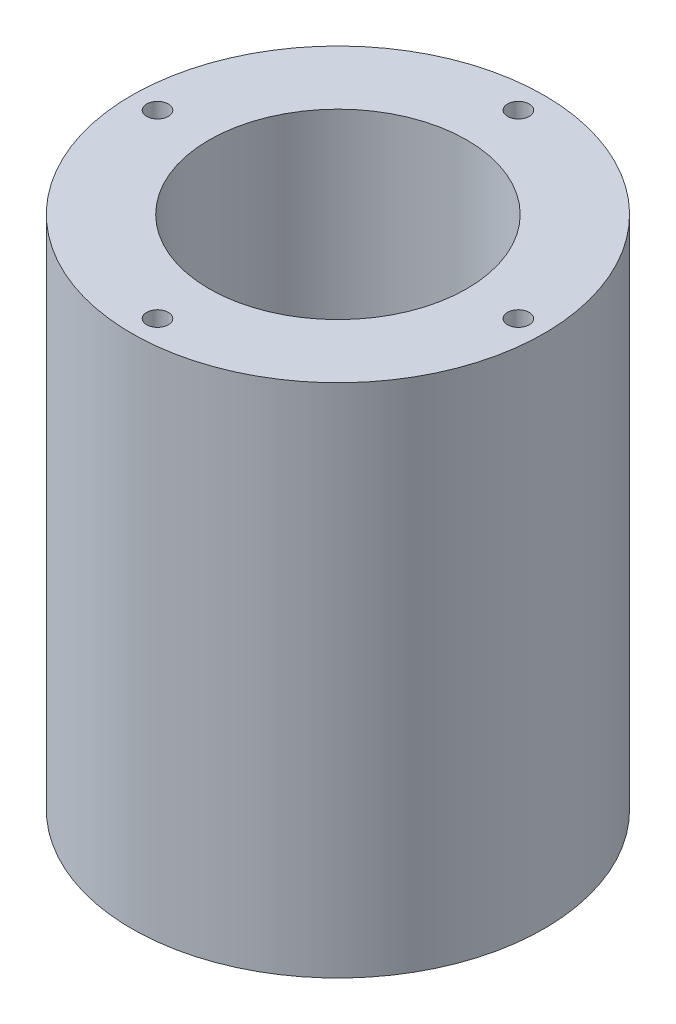
ISO-10303-21;
HEADER;
FILE_DESCRIPTION(('STEP AP214'),'2;1');
FILE_NAME('part.step','',(''),(''),'','','');
FILE_SCHEMA(('AUTOMOTIVE_DESIGN { 1 0 10303 214 1 1 1 1 }'));
ENDSEC;
DATA;
#1=APPLICATION_CONTEXT('core data for automotive mechanical design processes');
#2=APPLICATION_PROTOCOL_DEFINITION('international standard','automotive_design',2000,#1);
#3=PRODUCT_CONTEXT('',#1,'mechanical');
#4=PRODUCT('Part','Part','',(#3));
#5=PRODUCT_RELATED_PRODUCT_CATEGORY('part','',(#4));
#6=PRODUCT_DEFINITION_FORMATION('','',#4);
#7=PRODUCT_DEFINITION_CONTEXT('part definition',#1,'design');
#8=PRODUCT_DEFINITION('design','',#6,#7);
#9=PRODUCT_DEFINITION_SHAPE('','',#8);
#10=(LENGTH_UNIT() NAMED_UNIT(*) SI_UNIT(.MILLI.,.METRE.));
#11=(NAMED_UNIT(*) PLANE_ANGLE_UNIT() SI_UNIT($,.RADIAN.));
#12=(NAMED_UNIT(*) SI_UNIT($,.STERADIAN.) SOLID_ANGLE_UNIT());
#13=UNCERTAINTY_MEASURE_WITH_UNIT(LENGTH_MEASURE(1.E-05),#10,'distance_accuracy_value','');
#14=(GEOMETRIC_REPRESENTATION_CONTEXT(3) GLOBAL_UNCERTAINTY_ASSIGNED_CONTEXT((#13)) GLOBAL_UNIT_ASSIGNED_CONTEXT((#10,
#11,#12)) REPRESENTATION_CONTEXT('',''));
#15=CARTESIAN_POINT('',(0.,0.,0.));
#16=DIRECTION('',(0.,0.,1.));
#17=DIRECTION('',(1.,0.,0.));
#18=AXIS2_PLACEMENT_3D('',#15,#16,#17);
#19=CARTESIAN_POINT('',(0.,-4.99999999999999,0.));
#20=DIRECTION('',(0.,-1.,0.));
#21=DIRECTION('',(0.,0.,-1.));
#22=AXIS2_PLACEMENT_3D('',#19,#20,#21);
#23=PLANE('',#22);
#24=CARTESIAN_POINT('',(0.,-4.99999999999999,0.));
#25=DIRECTION('',(0.,-1.,0.));
#26=DIRECTION('',(0.,0.,-1.));
#27=AXIS2_PLACEMENT_3D('',#24,#25,#26);
#28=CIRCLE('',#27,9.);
#29=CARTESIAN_POINT('',(0.,-4.99999999999999,-9.));
#30=VERTEX_POINT('',#29);
#31=EDGE_CURVE('E362',#30,#30,#28,.T.);
#32=ORIENTED_EDGE('',*,*,#31,.F.);
#33=EDGE_LOOP('',(#32));
#34=FACE_BOUND('',#33,.T.);
#35=CARTESIAN_POINT('',(0.,-4.99999999999999,0.));
#36=DIRECTION('',(0.,-1.,0.));
#37=DIRECTION('',(0.,0.,-1.));
#38=AXIS2_PLACEMENT_3D('',#35,#36,#37);
#39=CIRCLE('',#38,11.1);
#40=CARTESIAN_POINT('',(0.,-4.99999999999999,-11.1));
#41=VERTEX_POINT('',#40);
#42=EDGE_CURVE('E176',#41,#41,#39,.F.);
#43=ORIENTED_EDGE('',*,*,#42,.F.);
#44=EDGE_LOOP('',(#43));
#45=FACE_BOUND('',#44,.T.);
#46=ADVANCED_FACE('F39',(#34,#45),#23,.T.);
#47=CARTESIAN_POINT('',(0.,50.,0.));
#48=DIRECTION('',(0.,-1.,0.));
#49=DIRECTION('',(0.,0.,-1.));
#50=AXIS2_PLACEMENT_3D('',#47,#48,#49);
#51=CYLINDRICAL_SURFACE('',#50,25.);
#52=CARTESIAN_POINT('',(0.,50.,0.));
#53=DIRECTION('',(0.,1.,0.));
#54=DIRECTION('',(0.,0.,1.));
#55=AXIS2_PLACEMENT_3D('',#52,#53,#54);
#56=CIRCLE('',#55,25.);
#57=CARTESIAN_POINT('',(0.,50.,25.));
#58=VERTEX_POINT('',#57);
#59=EDGE_CURVE('E280',#58,#58,#56,.T.);
#60=ORIENTED_EDGE('',*,*,#59,.T.);
#61=EDGE_LOOP('',(#60));
#62=FACE_BOUND('',#61,.T.);
#63=CARTESIAN_POINT('',(0.,-50.,0.));
#64=DIRECTION('',(0.,1.,0.));
#65=DIRECTION('',(0.,0.,1.));
#66=AXIS2_PLACEMENT_3D('',#63,#64,#65);
#67=CIRCLE('',#66,25.);
#68=CARTESIAN_POINT('',(0.,-50.,25.));
#69=VERTEX_POINT('',#68);
#70=EDGE_CURVE('E283',#69,#69,#67,.T.);
#71=ORIENTED_EDGE('',*,*,#70,.F.);
#72=EDGE_LOOP('',(#71));
#73=FACE_BOUND('',#72,.T.);
#74=DIRECTION('',(0.,-1.,0.));
#75=VECTOR('',#74,1.);
#76=CARTESIAN_POINT('',(-6.46564684594965,50.,24.1494391417992));
#77=LINE('',#76,#75);
#78=CARTESIAN_POINT('',(-6.46564684594965,12.,24.1494391417992));
#79=VERTEX_POINT('',#78);
#80=CARTESIAN_POINT('',(-6.46564684594965,-12.,24.1494391417992));
#81=VERTEX_POINT('',#80);
#82=EDGE_CURVE('E175',#79,#81,#77,.T.);
#83=ORIENTED_EDGE('',*,*,#82,.T.);
#84=CARTESIAN_POINT('',(0.,-12.,0.));
#85=DIRECTION('',(0.,-1.,0.));
#86=DIRECTION('',(0.,0.,-1.));
#87=AXIS2_PLACEMENT_3D('',#84,#85,#86);
#88=CIRCLE('',#87,25.);
#89=CARTESIAN_POINT('',(6.46564684594964,-12.,24.1494391417992));
#90=VERTEX_POINT('',#89);
#91=EDGE_CURVE('E172',#81,#90,#88,.F.);
#92=ORIENTED_EDGE('',*,*,#91,.T.);
#93=DIRECTION('',(0.,-1.,0.));
#94=VECTOR('',#93,1.);
#95=CARTESIAN_POINT('',(6.46564684594964,50.,24.1494391417992));
#96=LINE('',#95,#94);
#97=CARTESIAN_POINT('',(6.46564684594964,12.,24.1494391417992));
#98=VERTEX_POINT('',#97);
#99=EDGE_CURVE('E169',#90,#98,#96,.F.);
#100=ORIENTED_EDGE('',*,*,#99,.T.);
#101=CARTESIAN_POINT('',(0.,12.,0.));
#102=DIRECTION('',(0.,-1.,0.));
#103=DIRECTION('',(0.,0.,-1.));
#104=AXIS2_PLACEMENT_3D('',#101,#102,#103);
#105=CIRCLE('',#104,25.);
#106=EDGE_CURVE('E151',#79,#98,#105,.F.);
#107=ORIENTED_EDGE('',*,*,#106,.F.);
#108=EDGE_LOOP('',(#83,#92,#100,#107));
#109=FACE_BOUND('',#108,.T.);
#110=DIRECTION('',(0.,-1.,0.));
#111=VECTOR('',#110,1.);
#112=CARTESIAN_POINT('',(6.46564684594964,50.,-24.1494391417992));
#113=LINE('',#112,#111);
#114=CARTESIAN_POINT('',(6.46564684594964,12.,-24.1494391417992));
#115=VERTEX_POINT('',#114);
#116=CARTESIAN_POINT('',(6.46564684594964,-12.,-24.1494391417992));
#117=VERTEX_POINT('',#116);
#118=EDGE_CURVE('E267',#115,#117,#113,.T.);
#119=ORIENTED_EDGE('',*,*,#118,.T.);
#120=CARTESIAN_POINT('',(0.,-12.,0.));
#121=DIRECTION('',(0.,1.,0.));
#122=DIRECTION('',(0.,0.,1.));
#123=AXIS2_PLACEMENT_3D('',#120,#121,#122);
#124=CIRCLE('',#123,25.);
#125=CARTESIAN_POINT('',(-6.46564684594965,-12.,-24.1494391417992));
#126=VERTEX_POINT('',#125);
#127=EDGE_CURVE('E347',#126,#117,#124,.F.);
#128=ORIENTED_EDGE('',*,*,#127,.F.);
#129=DIRECTION('',(0.,-1.,0.));
#130=VECTOR('',#129,1.);
#131=CARTESIAN_POINT('',(-6.46564684594965,50.,-24.1494391417992));
#132=LINE('',#131,#130);
#133=CARTESIAN_POINT('',(-6.46564684594965,12.,-24.1494391417992));
#134=VERTEX_POINT('',#133);
#135=EDGE_CURVE('E270',#126,#134,#132,.F.);
#136=ORIENTED_EDGE('',*,*,#135,.T.);
#137=CARTESIAN_POINT('',(0.,12.,0.));
#138=DIRECTION('',(0.,1.,0.));
#139=DIRECTION('',(0.,0.,1.));
#140=AXIS2_PLACEMENT_3D('',#137,#138,#139);
#141=CIRCLE('',#140,25.);
#142=EDGE_CURVE('E353',#134,#115,#141,.F.);
#143=ORIENTED_EDGE('',*,*,#142,.T.);
#144=EDGE_LOOP('',(#119,#128,#136,#143));
#145=FACE_BOUND('',#144,.T.);
#146=ADVANCED_FACE('F170',(#62,#73,#109,#145),#51,.F.);
#147=CARTESIAN_POINT('',(0.,50.,0.));
#148=DIRECTION('',(0.,1.,0.));
#149=DIRECTION('',(0.,0.,1.));
#150=AXIS2_PLACEMENT_3D('',#147,#148,#149);
#151=PLANE('',#150);
#152=CARTESIAN_POINT('',(0.,50.,-35.));
#153=DIRECTION('',(0.,1.,0.));
#154=DIRECTION('',(0.,0.,1.));
#155=AXIS2_PLACEMENT_3D('',#152,#153,#154);
#156=CIRCLE('',#155,2.1);
#157=CARTESIAN_POINT('',(0.,50.,-32.9));
#158=VERTEX_POINT('',#157);
#159=EDGE_CURVE('E308',#158,#158,#156,.T.);
#160=ORIENTED_EDGE('',*,*,#159,.F.);
#161=EDGE_LOOP('',(#160));
#162=FACE_BOUND('',#161,.T.);
#163=CARTESIAN_POINT('',(35.000000000001,50.,-9.88330434368617E-13));
#164=DIRECTION('',(0.,1.,0.));
#165=DIRECTION('',(0.,0.,1.));
#166=AXIS2_PLACEMENT_3D('',#163,#164,#165);
#167=CIRCLE('',#166,2.1);
#168=CARTESIAN_POINT('',(35.000000000001,50.,2.09999999999901));
#169=VERTEX_POINT('',#168);
#170=EDGE_CURVE('E305',#169,#169,#167,.T.);
#171=ORIENTED_EDGE('',*,*,#170,.F.);
#172=EDGE_LOOP('',(#171));
#173=FACE_BOUND('',#172,.T.);
#174=CARTESIAN_POINT('',(1.97666086873723E-12,50.,35.));
#175=DIRECTION('',(0.,1.,0.));
#176=DIRECTION('',(0.,0.,1.));
#177=AXIS2_PLACEMENT_3D('',#174,#175,#176);
#178=CIRCLE('',#177,2.1);
#179=CARTESIAN_POINT('',(1.97666086873723E-12,50.,37.1));
#180=VERTEX_POINT('',#179);
#181=EDGE_CURVE('E299',#180,#180,#178,.T.);
#182=ORIENTED_EDGE('',*,*,#181,.F.);
#183=EDGE_LOOP('',(#182));
#184=FACE_BOUND('',#183,.T.);
#185=CARTESIAN_POINT('',(-34.999999999999,50.,9.92616698165632E-13));
#186=DIRECTION('',(0.,1.,0.));
#187=DIRECTION('',(0.,0.,1.));
#188=AXIS2_PLACEMENT_3D('',#185,#186,#187);
#189=CIRCLE('',#188,2.1);
#190=CARTESIAN_POINT('',(-34.999999999999,50.,2.10000000000099));
#191=VERTEX_POINT('',#190);
#192=EDGE_CURVE('E292',#191,#191,#189,.T.);
#193=ORIENTED_EDGE('',*,*,#192,.F.);
#194=EDGE_LOOP('',(#193));
#195=FACE_BOUND('',#194,.T.);
#196=CARTESIAN_POINT('',(0.,50.,0.));
#197=DIRECTION('',(0.,1.,0.));
#198=DIRECTION('',(0.,0.,1.));
#199=AXIS2_PLACEMENT_3D('',#196,#197,#198);
#200=CIRCLE('',#199,40.);
#201=CARTESIAN_POINT('',(0.,50.,-40.));
#202=VERTEX_POINT('',#201);
#203=EDGE_CURVE('E276',#202,#202,#200,.T.);
#204=ORIENTED_EDGE('',*,*,#203,.T.);
#205=EDGE_LOOP('',(#204));
#206=FACE_BOUND('',#205,.T.);
#207=ORIENTED_EDGE('',*,*,#59,.F.);
#208=EDGE_LOOP('',(#207));
#209=FACE_BOUND('',#208,.T.);
#210=ADVANCED_FACE('F416',(#162,#173,#184,#195,#206,#209),#151,.T.);
#211=CARTESIAN_POINT('',(0.,-50.,0.));
#212=DIRECTION('',(0.,1.,0.));
#213=DIRECTION('',(0.,0.,1.));
#214=AXIS2_PLACEMENT_3D('',#211,#212,#213);
#215=PLANE('',#214);
#216=CARTESIAN_POINT('',(0.,-50.,-35.));
#217=DIRECTION('',(0.,1.,0.));
#218=DIRECTION('',(0.,0.,1.));
#219=AXIS2_PLACEMENT_3D('',#216,#217,#218);
#220=CIRCLE('',#219,2.1);
#221=CARTESIAN_POINT('',(0.,-50.,-32.9));
#222=VERTEX_POINT('',#221);
#223=EDGE_CURVE('E331',#222,#222,#220,.T.);
#224=ORIENTED_EDGE('',*,*,#223,.T.);
#225=EDGE_LOOP('',(#224));
#226=FACE_BOUND('',#225,.T.);
#227=CARTESIAN_POINT('',(35.000000000001,-50.,-9.88330434368617E-13));
#228=DIRECTION('',(0.,1.,0.));
#229=DIRECTION('',(0.,0.,1.));
#230=AXIS2_PLACEMENT_3D('',#227,#228,#229);
#231=CIRCLE('',#230,2.1);
#232=CARTESIAN_POINT('',(35.000000000001,-50.,2.09999999999901));
#233=VERTEX_POINT('',#232);
#234=EDGE_CURVE('E325',#233,#233,#231,.T.);
#235=ORIENTED_EDGE('',*,*,#234,.T.);
#236=EDGE_LOOP('',(#235));
#237=FACE_BOUND('',#236,.T.);
#238=CARTESIAN_POINT('',(1.97666086873723E-12,-50.,35.));
#239=DIRECTION('',(0.,1.,0.));
#240=DIRECTION('',(0.,0.,1.));
#241=AXIS2_PLACEMENT_3D('',#238,#239,#240);
#242=CIRCLE('',#241,2.1);
#243=CARTESIAN_POINT('',(1.97666086873723E-12,-50.,37.1));
#244=VERTEX_POINT('',#243);
#245=EDGE_CURVE('E319',#244,#244,#242,.T.);
#246=ORIENTED_EDGE('',*,*,#245,.T.);
#247=EDGE_LOOP('',(#246));
#248=FACE_BOUND('',#247,.T.);
#249=CARTESIAN_POINT('',(-34.999999999999,-50.,9.92616698165632E-13));
#250=DIRECTION('',(0.,1.,0.));
#251=DIRECTION('',(0.,0.,1.));
#252=AXIS2_PLACEMENT_3D('',#249,#250,#251);
#253=CIRCLE('',#252,2.1);
#254=CARTESIAN_POINT('',(-34.999999999999,-50.,2.10000000000099));
#255=VERTEX_POINT('',#254);
#256=EDGE_CURVE('E313',#255,#255,#253,.T.);
#257=ORIENTED_EDGE('',*,*,#256,.T.);
#258=EDGE_LOOP('',(#257));
#259=FACE_BOUND('',#258,.T.);
#260=CARTESIAN_POINT('',(0.,-50.,0.));
#261=DIRECTION('',(0.,1.,0.));
#262=DIRECTION('',(0.,0.,1.));
#263=AXIS2_PLACEMENT_3D('',#260,#261,#262);
#264=CIRCLE('',#263,40.);
#265=CARTESIAN_POINT('',(0.,-50.,-40.));
#266=VERTEX_POINT('',#265);
#267=EDGE_CURVE('E277',#266,#266,#264,.T.);
#268=ORIENTED_EDGE('',*,*,#267,.F.);
#269=EDGE_LOOP('',(#268));
#270=FACE_BOUND('',#269,.T.);
#271=ORIENTED_EDGE('',*,*,#70,.T.);
#272=EDGE_LOOP('',(#271));
#273=FACE_BOUND('',#272,.T.);
#274=ADVANCED_FACE('F516',(#226,#237,#248,#259,#270,#273),#215,.F.);
#275=CARTESIAN_POINT('',(0.,50.,0.));
#276=DIRECTION('',(0.,-1.,0.));
#277=DIRECTION('',(0.,0.,-1.));
#278=AXIS2_PLACEMENT_3D('',#275,#276,#277);
#279=CYLINDRICAL_SURFACE('',#278,40.);
#280=CARTESIAN_POINT('',(0.,50.,-40.));
#281=CARTESIAN_POINT('',(0.,48.9583333333333,-40.));
#282=CARTESIAN_POINT('',(0.,47.9166666666667,-40.));
#283=CARTESIAN_POINT('',(0.,45.8333333333333,-40.));
#284=CARTESIAN_POINT('',(0.,44.7916666666667,-40.));
#285=CARTESIAN_POINT('',(0.,42.7083333333333,-40.));
#286=CARTESIAN_POINT('',(0.,41.6666666666667,-40.));
#287=CARTESIAN_POINT('',(0.,39.5833333333333,-40.));
#288=CARTESIAN_POINT('',(0.,38.5416666666667,-40.));
#289=CARTESIAN_POINT('',(0.,36.4583333333333,-40.));
#290=CARTESIAN_POINT('',(0.,35.4166666666667,-40.));
#291=CARTESIAN_POINT('',(0.,33.3333333333333,-40.));
#292=CARTESIAN_POINT('',(0.,32.2916666666667,-40.));
#293=CARTESIAN_POINT('',(0.,30.2083333333333,-40.));
#294=CARTESIAN_POINT('',(0.,29.1666666666667,-40.));
#295=CARTESIAN_POINT('',(0.,27.0833333333333,-40.));
#296=CARTESIAN_POINT('',(0.,26.0416666666667,-40.));
#297=CARTESIAN_POINT('',(0.,23.9583333333333,-40.));
#298=CARTESIAN_POINT('',(0.,22.9166666666667,-40.));
#299=CARTESIAN_POINT('',(0.,20.8333333333333,-40.));
#300=CARTESIAN_POINT('',(0.,19.7916666666667,-40.));
#301=CARTESIAN_POINT('',(0.,17.7083333333333,-40.));
#302=CARTESIAN_POINT('',(0.,16.6666666666667,-40.));
#303=CARTESIAN_POINT('',(0.,14.5833333333333,-40.));
#304=CARTESIAN_POINT('',(0.,13.5416666666667,-40.));
#305=CARTESIAN_POINT('',(0.,11.4583333333333,-40.));
#306=CARTESIAN_POINT('',(0.,10.4166666666667,-40.));
#307=CARTESIAN_POINT('',(0.,8.33333333333333,-40.));
#308=CARTESIAN_POINT('',(0.,7.29166666666666,-40.));
#309=CARTESIAN_POINT('',(0.,5.20833333333333,-40.));
#310=CARTESIAN_POINT('',(0.,4.16666666666666,-40.));
#311=CARTESIAN_POINT('',(0.,2.08333333333333,-40.));
#312=CARTESIAN_POINT('',(0.,1.04166666666666,-40.));
#313=CARTESIAN_POINT('',(0.,-1.04166666666667,-40.));
#314=CARTESIAN_POINT('',(0.,-2.08333333333334,-40.));
#315=CARTESIAN_POINT('',(0.,-4.16666666666667,-40.));
#316=CARTESIAN_POINT('',(0.,-5.20833333333334,-40.));
#317=CARTESIAN_POINT('',(0.,-7.29166666666667,-40.));
#318=CARTESIAN_POINT('',(0.,-8.33333333333334,-40.));
#319=CARTESIAN_POINT('',(0.,-10.4166666666667,-40.));
#320=CARTESIAN_POINT('',(0.,-11.4583333333333,-40.));
#321=CARTESIAN_POINT('',(0.,-13.5416666666667,-40.));
#322=CARTESIAN_POINT('',(0.,-14.5833333333333,-40.));
#323=CARTESIAN_POINT('',(0.,-16.6666666666667,-40.));
#324=CARTESIAN_POINT('',(0.,-17.7083333333333,-40.));
#325=CARTESIAN_POINT('',(0.,-19.7916666666667,-40.));
#326=CARTESIAN_POINT('',(0.,-20.8333333333333,-40.));
#327=CARTESIAN_POINT('',(0.,-22.9166666666667,-40.));
#328=CARTESIAN_POINT('',(0.,-23.9583333333333,-40.));
#329=CARTESIAN_POINT('',(0.,-26.0416666666667,-40.));
#330=CARTESIAN_POINT('',(0.,-27.0833333333333,-40.));
#331=CARTESIAN_POINT('',(0.,-29.1666666666667,-40.));
#332=CARTESIAN_POINT('',(0.,-30.2083333333333,-40.));
#333=CARTESIAN_POINT('',(0.,-32.2916666666667,-40.));
#334=CARTESIAN_POINT('',(0.,-33.3333333333333,-40.));
#335=CARTESIAN_POINT('',(0.,-35.4166666666667,-40.));
#336=CARTESIAN_POINT('',(0.,-36.4583333333333,-40.));
#337=CARTESIAN_POINT('',(0.,-38.5416666666667,-40.));
#338=CARTESIAN_POINT('',(0.,-39.5833333333333,-40.));
#339=CARTESIAN_POINT('',(0.,-41.6666666666667,-40.));
#340=CARTESIAN_POINT('',(0.,-42.7083333333333,-40.));
#341=CARTESIAN_POINT('',(0.,-44.7916666666667,-40.));
#342=CARTESIAN_POINT('',(0.,-45.8333333333333,-40.));
#343=CARTESIAN_POINT('',(0.,-47.9166666666667,-40.));
#344=CARTESIAN_POINT('',(0.,-48.9583333333333,-40.));
#345=CARTESIAN_POINT('',(0.,-50.,-40.));
#346=B_SPLINE_CURVE_WITH_KNOTS('',3,(#280,#281,#282,#283,#284,#285,#286,#287,#288,#289,#290,
#291,#292,#293,#294,#295,#296,#297,#298,#299,#300,#301,#302,#303,#304,#305,#306,#307,#308,#309,
#310,#311,#312,#313,#314,#315,#316,#317,#318,#319,#320,#321,#322,#323,#324,#325,#326,#327,#328,
#329,#330,#331,#332,#333,#334,#335,#336,#337,#338,#339,#340,#341,#342,#343,#344,#345),
.UNSPECIFIED.,.F.,.F.,(4,2,2,2,2,2,2,2,2,2,2,2,2,2,2,2,2,2,2,2,2,2,2,2,2,2,2,2,2,2,2,2,4),(0.,
3.125,6.25,9.37499999999999,12.5,15.625,18.75,21.875,25.,28.125,31.25,34.375,37.5,40.625,43.75,
46.875,50.,53.125,56.25,59.375,62.5,65.625,68.75,71.875,75.,78.125,81.25,84.375,87.5,90.625,
93.75,96.875,100.),.UNSPECIFIED.);
#347=EDGE_CURVE('BSEAM509',#202,#266,#346,.T.);
#348=ORIENTED_EDGE('',*,*,#203,.F.);
#349=ORIENTED_EDGE('',*,*,#267,.T.);
#350=ORIENTED_EDGE('',*,*,#347,.T.);
#351=ORIENTED_EDGE('',*,*,#347,.F.);
#352=EDGE_LOOP('',(#348,#350,#349,#351));
#353=FACE_BOUND('',#352,.T.);
#354=ADVANCED_FACE('F509',(#353),#279,.T.);
#355=CARTESIAN_POINT('',(-34.999999999999,40.,9.92616698165632E-13));
#356=DIRECTION('',(0.,1.,0.));
#357=DIRECTION('',(0.,0.,1.));
#358=AXIS2_PLACEMENT_3D('',#355,#356,#357);
#359=CYLINDRICAL_SURFACE('',#358,2.1);
#360=CARTESIAN_POINT('',(-34.999999999999,40.,9.92616698165632E-13));
#361=DIRECTION('',(0.,1.,0.));
#362=DIRECTION('',(0.,0.,1.));
#363=AXIS2_PLACEMENT_3D('',#360,#361,#362);
#364=CIRCLE('',#363,2.1);
#365=CARTESIAN_POINT('',(-34.999999999999,40.,2.10000000000099));
#366=VERTEX_POINT('',#365);
#367=EDGE_CURVE('E289',#366,#366,#364,.T.);
#368=ORIENTED_EDGE('',*,*,#367,.F.);
#369=EDGE_LOOP('',(#368));
#370=FACE_BOUND('',#369,.T.);
#371=ORIENTED_EDGE('',*,*,#192,.T.);
#372=EDGE_LOOP('',(#371));
#373=FACE_BOUND('',#372,.T.);
#374=ADVANCED_FACE('F506',(#370,#373),#359,.F.);
#375=CARTESIAN_POINT('',(-34.999999999999,40.,9.92616698165632E-13));
#376=DIRECTION('',(0.,1.,0.));
#377=DIRECTION('',(0.,0.,1.));
#378=AXIS2_PLACEMENT_3D('',#375,#376,#377);
#379=PLANE('',#378);
#380=ORIENTED_EDGE('',*,*,#367,.T.);
#381=EDGE_LOOP('',(#380));
#382=FACE_BOUND('',#381,.T.);
#383=ADVANCED_FACE('F501',(#382),#379,.T.);
#384=CARTESIAN_POINT('',(1.97666086873723E-12,40.,35.));
#385=DIRECTION('',(0.,1.,0.));
#386=DIRECTION('',(0.,0.,1.));
#387=AXIS2_PLACEMENT_3D('',#384,#385,#386);
#388=CYLINDRICAL_SURFACE('',#387,2.1);
#389=CARTESIAN_POINT('',(1.97666086873723E-12,40.,35.));
#390=DIRECTION('',(0.,1.,0.));
#391=DIRECTION('',(0.,0.,1.));
#392=AXIS2_PLACEMENT_3D('',#389,#390,#391);
#393=CIRCLE('',#392,2.1);
#394=CARTESIAN_POINT('',(1.97666086873723E-12,40.,37.1));
#395=VERTEX_POINT('',#394);
#396=EDGE_CURVE('E296',#395,#395,#393,.T.);
#397=ORIENTED_EDGE('',*,*,#396,.F.);
#398=EDGE_LOOP('',(#397));
#399=FACE_BOUND('',#398,.T.);
#400=ORIENTED_EDGE('',*,*,#181,.T.);
#401=EDGE_LOOP('',(#400));
#402=FACE_BOUND('',#401,.T.);
#403=ADVANCED_FACE('F498',(#399,#402),#388,.F.);
#404=CARTESIAN_POINT('',(1.97666086873723E-12,40.,35.));
#405=DIRECTION('',(0.,1.,0.));
#406=DIRECTION('',(0.,0.,1.));
#407=AXIS2_PLACEMENT_3D('',#404,#405,#406);
#408=PLANE('',#407);
#409=ORIENTED_EDGE('',*,*,#396,.T.);
#410=EDGE_LOOP('',(#409));
#411=FACE_BOUND('',#410,.T.);
#412=ADVANCED_FACE('F493',(#411),#408,.T.);
#413=CARTESIAN_POINT('',(35.000000000001,40.,-9.88330434368617E-13));
#414=DIRECTION('',(0.,1.,0.));
#415=DIRECTION('',(0.,0.,1.));
#416=AXIS2_PLACEMENT_3D('',#413,#414,#415);
#417=CYLINDRICAL_SURFACE('',#416,2.1);
#418=CARTESIAN_POINT('',(35.000000000001,40.,-9.88330434368617E-13));
#419=DIRECTION('',(0.,1.,0.));
#420=DIRECTION('',(0.,0.,1.));
#421=AXIS2_PLACEMENT_3D('',#418,#419,#420);
#422=CIRCLE('',#421,2.1);
#423=CARTESIAN_POINT('',(35.000000000001,40.,2.09999999999901));
#424=VERTEX_POINT('',#423);
#425=EDGE_CURVE('E302',#424,#424,#422,.T.);
#426=ORIENTED_EDGE('',*,*,#425,.F.);
#427=EDGE_LOOP('',(#426));
#428=FACE_BOUND('',#427,.T.);
#429=ORIENTED_EDGE('',*,*,#170,.T.);
#430=EDGE_LOOP('',(#429));
#431=FACE_BOUND('',#430,.T.);
#432=ADVANCED_FACE('F490',(#428,#431),#417,.F.);
#433=CARTESIAN_POINT('',(35.000000000001,40.,-9.88330434368617E-13));
#434=DIRECTION('',(0.,1.,0.));
#435=DIRECTION('',(0.,0.,1.));
#436=AXIS2_PLACEMENT_3D('',#433,#434,#435);
#437=PLANE('',#436);
#438=ORIENTED_EDGE('',*,*,#425,.T.);
#439=EDGE_LOOP('',(#438));
#440=FACE_BOUND('',#439,.T.);
#441=ADVANCED_FACE('F488',(#440),#437,.T.);
#442=CARTESIAN_POINT('',(0.,40.,-35.));
#443=DIRECTION('',(0.,1.,0.));
#444=DIRECTION('',(0.,0.,1.));
#445=AXIS2_PLACEMENT_3D('',#442,#443,#444);
#446=CYLINDRICAL_SURFACE('',#445,2.1);
#447=CARTESIAN_POINT('',(0.,40.,-35.));
#448=DIRECTION('',(0.,1.,0.));
#449=DIRECTION('',(0.,0.,1.));
#450=AXIS2_PLACEMENT_3D('',#447,#448,#449);
#451=CIRCLE('',#450,2.1);
#452=CARTESIAN_POINT('',(0.,40.,-32.9));
#453=VERTEX_POINT('',#452);
#454=EDGE_CURVE('E286',#453,#453,#451,.T.);
#455=ORIENTED_EDGE('',*,*,#454,.F.);
#456=EDGE_LOOP('',(#455));
#457=FACE_BOUND('',#456,.T.);
#458=ORIENTED_EDGE('',*,*,#159,.T.);
#459=EDGE_LOOP('',(#458));
#460=FACE_BOUND('',#459,.T.);
#461=ADVANCED_FACE('F484',(#457,#460),#446,.F.);
#462=CARTESIAN_POINT('',(0.,40.,-35.));
#463=DIRECTION('',(0.,1.,0.));
#464=DIRECTION('',(0.,0.,1.));
#465=AXIS2_PLACEMENT_3D('',#462,#463,#464);
#466=PLANE('',#465);
#467=ORIENTED_EDGE('',*,*,#454,.T.);
#468=EDGE_LOOP('',(#467));
#469=FACE_BOUND('',#468,.T.);
#470=ADVANCED_FACE('F480',(#469),#466,.T.);
#471=CARTESIAN_POINT('',(-34.999999999999,-40.,9.92616698165632E-13));
#472=DIRECTION('',(0.,-1.,0.));
#473=DIRECTION('',(0.,0.,-1.));
#474=AXIS2_PLACEMENT_3D('',#471,#472,#473);
#475=CYLINDRICAL_SURFACE('',#474,2.1);
#476=CARTESIAN_POINT('',(-34.999999999999,-40.,9.92616698165632E-13));
#477=DIRECTION('',(0.,1.,0.));
#478=DIRECTION('',(0.,0.,1.));
#479=AXIS2_PLACEMENT_3D('',#476,#477,#478);
#480=CIRCLE('',#479,2.1);
#481=CARTESIAN_POINT('',(-34.999999999999,-40.,2.10000000000099));
#482=VERTEX_POINT('',#481);
#483=EDGE_CURVE('E316',#482,#482,#480,.T.);
#484=ORIENTED_EDGE('',*,*,#483,.T.);
#485=EDGE_LOOP('',(#484));
#486=FACE_BOUND('',#485,.T.);
#487=ORIENTED_EDGE('',*,*,#256,.F.);
#488=EDGE_LOOP('',(#487));
#489=FACE_BOUND('',#488,.T.);
#490=ADVANCED_FACE('F476',(#486,#489),#475,.F.);
#491=CARTESIAN_POINT('',(-34.999999999999,-40.,9.92616698165632E-13));
#492=DIRECTION('',(0.,-1.,0.));
#493=DIRECTION('',(0.,0.,1.));
#494=AXIS2_PLACEMENT_3D('',#491,#492,#493);
#495=PLANE('',#494);
#496=ORIENTED_EDGE('',*,*,#483,.F.);
#497=EDGE_LOOP('',(#496));
#498=FACE_BOUND('',#497,.T.);
#499=ADVANCED_FACE('F472',(#498),#495,.T.);
#500=CARTESIAN_POINT('',(1.97666086873723E-12,-40.,35.));
#501=DIRECTION('',(0.,-1.,0.));
#502=DIRECTION('',(0.,0.,-1.));
#503=AXIS2_PLACEMENT_3D('',#500,#501,#502);
#504=CYLINDRICAL_SURFACE('',#503,2.1);
#505=CARTESIAN_POINT('',(1.97666086873723E-12,-40.,35.));
#506=DIRECTION('',(0.,1.,0.));
#507=DIRECTION('',(0.,0.,1.));
#508=AXIS2_PLACEMENT_3D('',#505,#506,#507);
#509=CIRCLE('',#508,2.1);
#510=CARTESIAN_POINT('',(1.97666086873723E-12,-40.,37.1));
#511=VERTEX_POINT('',#510);
#512=EDGE_CURVE('E322',#511,#511,#509,.T.);
#513=ORIENTED_EDGE('',*,*,#512,.T.);
#514=EDGE_LOOP('',(#513));
#515=FACE_BOUND('',#514,.T.);
#516=ORIENTED_EDGE('',*,*,#245,.F.);
#517=EDGE_LOOP('',(#516));
#518=FACE_BOUND('',#517,.T.);
#519=ADVANCED_FACE('F468',(#515,#518),#504,.F.);
#520=CARTESIAN_POINT('',(1.97666086873723E-12,-40.,35.));
#521=DIRECTION('',(0.,-1.,0.));
#522=DIRECTION('',(0.,0.,1.));
#523=AXIS2_PLACEMENT_3D('',#520,#521,#522);
#524=PLANE('',#523);
#525=ORIENTED_EDGE('',*,*,#512,.F.);
#526=EDGE_LOOP('',(#525));
#527=FACE_BOUND('',#526,.T.);
#528=ADVANCED_FACE('F464',(#527),#524,.T.);
#529=CARTESIAN_POINT('',(35.000000000001,-40.,-9.88330434368617E-13));
#530=DIRECTION('',(0.,-1.,0.));
#531=DIRECTION('',(0.,0.,-1.));
#532=AXIS2_PLACEMENT_3D('',#529,#530,#531);
#533=CYLINDRICAL_SURFACE('',#532,2.1);
#534=CARTESIAN_POINT('',(35.000000000001,-40.,-9.88330434368617E-13));
#535=DIRECTION('',(0.,1.,0.));
#536=DIRECTION('',(0.,0.,1.));
#537=AXIS2_PLACEMENT_3D('',#534,#535,#536);
#538=CIRCLE('',#537,2.1);
#539=CARTESIAN_POINT('',(35.000000000001,-40.,2.09999999999901));
#540=VERTEX_POINT('',#539);
#541=EDGE_CURVE('E328',#540,#540,#538,.T.);
#542=ORIENTED_EDGE('',*,*,#541,.T.);
#543=EDGE_LOOP('',(#542));
#544=FACE_BOUND('',#543,.T.);
#545=ORIENTED_EDGE('',*,*,#234,.F.);
#546=EDGE_LOOP('',(#545));
#547=FACE_BOUND('',#546,.T.);
#548=ADVANCED_FACE('F460',(#544,#547),#533,.F.);
#549=CARTESIAN_POINT('',(35.000000000001,-40.,-9.88330434368617E-13));
#550=DIRECTION('',(0.,-1.,0.));
#551=DIRECTION('',(0.,0.,1.));
#552=AXIS2_PLACEMENT_3D('',#549,#550,#551);
#553=PLANE('',#552);
#554=ORIENTED_EDGE('',*,*,#541,.F.);
#555=EDGE_LOOP('',(#554));
#556=FACE_BOUND('',#555,.T.);
#557=ADVANCED_FACE('F456',(#556),#553,.T.);
#558=CARTESIAN_POINT('',(0.,-40.,-35.));
#559=DIRECTION('',(0.,-1.,0.));
#560=DIRECTION('',(0.,0.,-1.));
#561=AXIS2_PLACEMENT_3D('',#558,#559,#560);
#562=CYLINDRICAL_SURFACE('',#561,2.1);
#563=CARTESIAN_POINT('',(0.,-40.,-35.));
#564=DIRECTION('',(0.,1.,0.));
#565=DIRECTION('',(0.,0.,1.));
#566=AXIS2_PLACEMENT_3D('',#563,#564,#565);
#567=CIRCLE('',#566,2.1);
#568=CARTESIAN_POINT('',(0.,-40.,-32.9));
#569=VERTEX_POINT('',#568);
#570=EDGE_CURVE('E293',#569,#569,#567,.T.);
#571=ORIENTED_EDGE('',*,*,#570,.T.);
#572=EDGE_LOOP('',(#571));
#573=FACE_BOUND('',#572,.T.);
#574=ORIENTED_EDGE('',*,*,#223,.F.);
#575=EDGE_LOOP('',(#574));
#576=FACE_BOUND('',#575,.T.);
#577=ADVANCED_FACE('F452',(#573,#576),#562,.F.);
#578=CARTESIAN_POINT('',(0.,-40.,-35.));
#579=DIRECTION('',(0.,-1.,0.));
#580=DIRECTION('',(0.,0.,1.));
#581=AXIS2_PLACEMENT_3D('',#578,#579,#580);
#582=PLANE('',#581);
#583=ORIENTED_EDGE('',*,*,#570,.F.);
#584=EDGE_LOOP('',(#583));
#585=FACE_BOUND('',#584,.T.);
#586=ADVANCED_FACE('F446',(#585),#582,.T.);
#587=CARTESIAN_POINT('',(0.,12.,0.));
#588=DIRECTION('',(0.984807753012208,0.,0.173648177666931));
#589=DIRECTION('',(0.173648177666931,0.,-0.984807753012208));
#590=AXIS2_PLACEMENT_3D('',#587,#588,#589);
#591=PLANE('',#590);
#592=DIRECTION('',(-0.173648177666931,0.,0.984807753012208));
#593=VECTOR('',#592,1.);
#594=CARTESIAN_POINT('',(0.,-12.,0.));
#595=LINE('',#594,#593);
#596=CARTESIAN_POINT('',(-2.93151864022867,-12.,16.6254683681992));
#597=VERTEX_POINT('',#596);
#598=CARTESIAN_POINT('',(-3.97877959224926,-12.,22.5647803657891));
#599=VERTEX_POINT('',#598);
#600=EDGE_CURVE('E242',#597,#599,#595,.T.);
#601=ORIENTED_EDGE('',*,*,#600,.T.);
#602=DIRECTION('',(0.,-1.,0.));
#603=VECTOR('',#602,1.);
#604=CARTESIAN_POINT('',(-3.97877959224926,12.,22.5647803657891));
#605=LINE('',#604,#603);
#606=CARTESIAN_POINT('',(-3.97877959224926,12.,22.5647803657891));
#607=VERTEX_POINT('',#606);
#608=EDGE_CURVE('E249',#599,#607,#605,.F.);
#609=ORIENTED_EDGE('',*,*,#608,.T.);
#610=DIRECTION('',(-0.173648177666931,0.,0.984807753012208));
#611=VECTOR('',#610,1.);
#612=CARTESIAN_POINT('',(0.,12.,0.));
#613=LINE('',#612,#611);
#614=CARTESIAN_POINT('',(-2.93151864022867,12.,16.6254683681992));
#615=VERTEX_POINT('',#614);
#616=EDGE_CURVE('E165',#615,#607,#613,.T.);
#617=ORIENTED_EDGE('',*,*,#616,.F.);
#618=DIRECTION('',(0.,1.,0.));
#619=VECTOR('',#618,1.);
#620=CARTESIAN_POINT('',(-2.93151864022867,12.,16.6254683681992));
#621=LINE('',#620,#619);
#622=EDGE_CURVE('E251',#615,#597,#621,.F.);
#623=ORIENTED_EDGE('',*,*,#622,.T.);
#624=EDGE_LOOP('',(#601,#609,#617,#623));
#625=FACE_BOUND('',#624,.T.);
#626=ADVANCED_FACE('F247',(#625),#591,.F.);
#627=CARTESIAN_POINT('',(0.,12.,0.));
#628=DIRECTION('',(0.984807753012208,0.,-0.173648177666931));
#629=DIRECTION('',(-0.173648177666931,0.,-0.984807753012208));
#630=AXIS2_PLACEMENT_3D('',#627,#628,#629);
#631=PLANE('',#630);
#632=DIRECTION('',(0.173648177666931,0.,0.984807753012208));
#633=VECTOR('',#632,1.);
#634=CARTESIAN_POINT('',(0.,12.,0.));
#635=LINE('',#634,#633);
#636=CARTESIAN_POINT('',(2.93151864022866,12.,16.6254683681992));
#637=VERTEX_POINT('',#636);
#638=CARTESIAN_POINT('',(3.97877959224925,12.,22.5647803657891));
#639=VERTEX_POINT('',#638);
#640=EDGE_CURVE('E166',#637,#639,#635,.T.);
#641=ORIENTED_EDGE('',*,*,#640,.T.);
#642=DIRECTION('',(0.,1.,0.));
#643=VECTOR('',#642,1.);
#644=CARTESIAN_POINT('',(3.97877959224925,-12.,22.5647803657891));
#645=LINE('',#644,#643);
#646=CARTESIAN_POINT('',(3.97877959224925,-12.,22.5647803657891));
#647=VERTEX_POINT('',#646);
#648=EDGE_CURVE('E181',#639,#647,#645,.F.);
#649=ORIENTED_EDGE('',*,*,#648,.T.);
#650=DIRECTION('',(0.173648177666931,0.,0.984807753012208));
#651=VECTOR('',#650,1.);
#652=CARTESIAN_POINT('',(0.,-12.,0.));
#653=LINE('',#652,#651);
#654=CARTESIAN_POINT('',(2.93151864022866,-12.,16.6254683681992));
#655=VERTEX_POINT('',#654);
#656=EDGE_CURVE('E337',#655,#647,#653,.T.);
#657=ORIENTED_EDGE('',*,*,#656,.F.);
#658=DIRECTION('',(0.,-1.,0.));
#659=VECTOR('',#658,1.);
#660=CARTESIAN_POINT('',(2.93151864022866,12.,16.6254683681992));
#661=LINE('',#660,#659);
#662=EDGE_CURVE('E220',#655,#637,#661,.F.);
#663=ORIENTED_EDGE('',*,*,#662,.T.);
#664=EDGE_LOOP('',(#641,#649,#657,#663));
#665=FACE_BOUND('',#664,.T.);
#666=ADVANCED_FACE('F441',(#665),#631,.T.);
#667=CARTESIAN_POINT('',(0.,12.,0.));
#668=DIRECTION('',(0.,-1.,0.));
#669=DIRECTION('',(0.,0.,-1.));
#670=AXIS2_PLACEMENT_3D('',#667,#668,#669);
#671=PLANE('',#670);
#672=ORIENTED_EDGE('',*,*,#640,.F.);
#673=CARTESIAN_POINT('',(4.90113414625308,12.,16.2781720128653));
#674=DIRECTION('',(0.,-1.,0.));
#675=DIRECTION('',(0.,0.,-1.));
#676=AXIS2_PLACEMENT_3D('',#673,#674,#675);
#677=CIRCLE('',#676,2.);
#678=CARTESIAN_POINT('',(4.32453012904683,12.,14.3630929525282));
#679=VERTEX_POINT('',#678);
#680=EDGE_CURVE('E196',#637,#679,#677,.T.);
#681=ORIENTED_EDGE('',*,*,#680,.T.);
#682=CARTESIAN_POINT('',(0.,12.,0.));
#683=DIRECTION('',(0.,1.,0.));
#684=DIRECTION('',(0.,0.,1.));
#685=AXIS2_PLACEMENT_3D('',#682,#683,#684);
#686=CIRCLE('',#685,15.);
#687=CARTESIAN_POINT('',(4.32453012904683,12.,-14.3630929525282));
#688=VERTEX_POINT('',#687);
#689=EDGE_CURVE('E200',#679,#688,#686,.T.);
#690=ORIENTED_EDGE('',*,*,#689,.T.);
#691=CARTESIAN_POINT('',(4.90113414625308,12.,-16.2781720128653));
#692=DIRECTION('',(0.,-1.,0.));
#693=DIRECTION('',(0.,0.,-1.));
#694=AXIS2_PLACEMENT_3D('',#691,#692,#693);
#695=CIRCLE('',#694,2.);
#696=CARTESIAN_POINT('',(2.93151864022866,12.,-16.6254683681992));
#697=VERTEX_POINT('',#696);
#698=EDGE_CURVE('E185',#688,#697,#695,.T.);
#699=ORIENTED_EDGE('',*,*,#698,.T.);
#700=DIRECTION('',(0.173648177666931,0.,-0.984807753012208));
#701=VECTOR('',#700,1.);
#702=CARTESIAN_POINT('',(0.,12.,0.));
#703=LINE('',#702,#701);
#704=CARTESIAN_POINT('',(3.97877959224925,12.,-22.5647803657891));
#705=VERTEX_POINT('',#704);
#706=EDGE_CURVE('E340',#697,#705,#703,.T.);
#707=ORIENTED_EDGE('',*,*,#706,.T.);
#708=CARTESIAN_POINT('',(5.94839509827367,12.,-22.2174840104552));
#709=DIRECTION('',(0.,-1.,0.));
#710=DIRECTION('',(0.,0.,-1.));
#711=AXIS2_PLACEMENT_3D('',#708,#709,#710);
#712=CIRCLE('',#711,2.);
#713=EDGE_CURVE('E229',#705,#115,#712,.T.);
#714=ORIENTED_EDGE('',*,*,#713,.T.);
#715=ORIENTED_EDGE('',*,*,#142,.F.);
#716=CARTESIAN_POINT('',(-5.94839509827368,12.,-22.2174840104552));
#717=DIRECTION('',(0.,-1.,0.));
#718=DIRECTION('',(0.,0.,-1.));
#719=AXIS2_PLACEMENT_3D('',#716,#717,#718);
#720=CIRCLE('',#719,2.);
#721=CARTESIAN_POINT('',(-3.97877959224926,12.,-22.5647803657891));
#722=VERTEX_POINT('',#721);
#723=EDGE_CURVE('E235',#134,#722,#720,.T.);
#724=ORIENTED_EDGE('',*,*,#723,.T.);
#725=DIRECTION('',(-0.173648177666931,0.,-0.984807753012208));
#726=VECTOR('',#725,1.);
#727=CARTESIAN_POINT('',(0.,12.,0.));
#728=LINE('',#727,#726);
#729=CARTESIAN_POINT('',(-2.93151864022867,12.,-16.6254683681992));
#730=VERTEX_POINT('',#729);
#731=EDGE_CURVE('E346',#730,#722,#728,.T.);
#732=ORIENTED_EDGE('',*,*,#731,.F.);
#733=CARTESIAN_POINT('',(-4.90113414625308,12.,-16.2781720128653));
#734=DIRECTION('',(0.,-1.,0.));
#735=DIRECTION('',(0.,0.,-1.));
#736=AXIS2_PLACEMENT_3D('',#733,#734,#735);
#737=CIRCLE('',#736,2.);
#738=CARTESIAN_POINT('',(-4.32453012904684,12.,-14.3630929525282));
#739=VERTEX_POINT('',#738);
#740=EDGE_CURVE('E192',#730,#739,#737,.T.);
#741=ORIENTED_EDGE('',*,*,#740,.T.);
#742=CARTESIAN_POINT('',(-4.32453012904684,12.,14.3630929525282));
#743=VERTEX_POINT('',#742);
#744=EDGE_CURVE('E214',#739,#743,#686,.T.);
#745=ORIENTED_EDGE('',*,*,#744,.T.);
#746=CARTESIAN_POINT('',(-4.90113414625308,12.,16.2781720128653));
#747=DIRECTION('',(0.,-1.,0.));
#748=DIRECTION('',(0.,0.,-1.));
#749=AXIS2_PLACEMENT_3D('',#746,#747,#748);
#750=CIRCLE('',#749,2.);
#751=EDGE_CURVE('E11',#743,#615,#750,.T.);
#752=ORIENTED_EDGE('',*,*,#751,.T.);
#753=ORIENTED_EDGE('',*,*,#616,.T.);
#754=CARTESIAN_POINT('',(-5.94839509827368,12.,22.2174840104552));
#755=DIRECTION('',(0.,-1.,0.));
#756=DIRECTION('',(0.,0.,-1.));
#757=AXIS2_PLACEMENT_3D('',#754,#755,#756);
#758=CIRCLE('',#757,2.);
#759=EDGE_CURVE('E161',#607,#79,#758,.T.);
#760=ORIENTED_EDGE('',*,*,#759,.T.);
#761=ORIENTED_EDGE('',*,*,#106,.T.);
#762=CARTESIAN_POINT('',(5.94839509827367,12.,22.2174840104552));
#763=DIRECTION('',(0.,-1.,0.));
#764=DIRECTION('',(0.,0.,-1.));
#765=AXIS2_PLACEMENT_3D('',#762,#763,#764);
#766=CIRCLE('',#765,2.);
#767=EDGE_CURVE('E157',#98,#639,#766,.T.);
#768=ORIENTED_EDGE('',*,*,#767,.T.);
#769=EDGE_LOOP('',(#672,#681,#690,#699,#707,#714,#715,#724,#732,#741,#745,#752,#753,#760,#761,#768));
#770=FACE_BOUND('',#769,.T.);
#771=CARTESIAN_POINT('',(0.,12.,0.));
#772=DIRECTION('',(0.,1.,0.));
#773=DIRECTION('',(0.,0.,1.));
#774=AXIS2_PLACEMENT_3D('',#771,#772,#773);
#775=CIRCLE('',#774,11.1);
#776=CARTESIAN_POINT('',(0.,12.,11.1));
#777=VERTEX_POINT('',#776);
#778=EDGE_CURVE('E359',#777,#777,#775,.T.);
#779=ORIENTED_EDGE('',*,*,#778,.F.);
#780=EDGE_LOOP('',(#779));
#781=FACE_BOUND('',#780,.T.);
#782=ADVANCED_FACE('F154',(#770,#781),#671,.F.);
#783=CARTESIAN_POINT('',(0.,-12.,0.));
#784=DIRECTION('',(0.,-1.,0.));
#785=DIRECTION('',(0.,0.,-1.));
#786=AXIS2_PLACEMENT_3D('',#783,#784,#785);
#787=PLANE('',#786);
#788=ORIENTED_EDGE('',*,*,#600,.F.);
#789=CARTESIAN_POINT('',(-4.90113414625308,-12.,16.2781720128653));
#790=DIRECTION('',(0.,-1.,0.));
#791=DIRECTION('',(0.,0.,-1.));
#792=AXIS2_PLACEMENT_3D('',#789,#790,#791);
#793=CIRCLE('',#792,2.);
#794=CARTESIAN_POINT('',(-4.32453012904684,-12.,14.3630929525282));
#795=VERTEX_POINT('',#794);
#796=EDGE_CURVE('E47',#597,#795,#793,.F.);
#797=ORIENTED_EDGE('',*,*,#796,.T.);
#798=CARTESIAN_POINT('',(0.,-12.,0.));
#799=DIRECTION('',(0.,-1.,0.));
#800=DIRECTION('',(0.,0.,-1.));
#801=AXIS2_PLACEMENT_3D('',#798,#799,#800);
#802=CIRCLE('',#801,15.);
#803=CARTESIAN_POINT('',(-4.32453012904684,-12.,-14.3630929525282));
#804=VERTEX_POINT('',#803);
#805=EDGE_CURVE('E374',#795,#804,#802,.T.);
#806=ORIENTED_EDGE('',*,*,#805,.T.);
#807=CARTESIAN_POINT('',(-4.90113414625308,-12.,-16.2781720128653));
#808=DIRECTION('',(0.,-1.,0.));
#809=DIRECTION('',(0.,0.,-1.));
#810=AXIS2_PLACEMENT_3D('',#807,#808,#809);
#811=CIRCLE('',#810,2.);
#812=CARTESIAN_POINT('',(-2.93151864022867,-12.,-16.6254683681992));
#813=VERTEX_POINT('',#812);
#814=EDGE_CURVE('E54',#804,#813,#811,.F.);
#815=ORIENTED_EDGE('',*,*,#814,.T.);
#816=DIRECTION('',(-0.173648177666931,0.,-0.984807753012208));
#817=VECTOR('',#816,1.);
#818=CARTESIAN_POINT('',(0.,-12.,0.));
#819=LINE('',#818,#817);
#820=CARTESIAN_POINT('',(-3.97877959224926,-12.,-22.5647803657891));
#821=VERTEX_POINT('',#820);
#822=EDGE_CURVE('E213',#813,#821,#819,.T.);
#823=ORIENTED_EDGE('',*,*,#822,.T.);
#824=CARTESIAN_POINT('',(-5.94839509827368,-12.,-22.2174840104552));
#825=DIRECTION('',(0.,-1.,0.));
#826=DIRECTION('',(0.,0.,-1.));
#827=AXIS2_PLACEMENT_3D('',#824,#825,#826);
#828=CIRCLE('',#827,2.);
#829=EDGE_CURVE('E232',#821,#126,#828,.F.);
#830=ORIENTED_EDGE('',*,*,#829,.T.);
#831=ORIENTED_EDGE('',*,*,#127,.T.);
#832=CARTESIAN_POINT('',(5.94839509827367,-12.,-22.2174840104552));
#833=DIRECTION('',(0.,-1.,0.));
#834=DIRECTION('',(0.,0.,-1.));
#835=AXIS2_PLACEMENT_3D('',#832,#833,#834);
#836=CIRCLE('',#835,2.);
#837=CARTESIAN_POINT('',(3.97877959224925,-12.,-22.5647803657891));
#838=VERTEX_POINT('',#837);
#839=EDGE_CURVE('E227',#117,#838,#836,.F.);
#840=ORIENTED_EDGE('',*,*,#839,.T.);
#841=DIRECTION('',(0.173648177666931,0.,-0.984807753012208));
#842=VECTOR('',#841,1.);
#843=CARTESIAN_POINT('',(0.,-12.,0.));
#844=LINE('',#843,#842);
#845=CARTESIAN_POINT('',(2.93151864022866,-12.,-16.6254683681992));
#846=VERTEX_POINT('',#845);
#847=EDGE_CURVE('E343',#846,#838,#844,.T.);
#848=ORIENTED_EDGE('',*,*,#847,.F.);
#849=CARTESIAN_POINT('',(4.90113414625308,-12.,-16.2781720128653));
#850=DIRECTION('',(0.,-1.,0.));
#851=DIRECTION('',(0.,0.,-1.));
#852=AXIS2_PLACEMENT_3D('',#849,#850,#851);
#853=CIRCLE('',#852,2.);
#854=CARTESIAN_POINT('',(4.32453012904683,-12.,-14.3630929525282));
#855=VERTEX_POINT('',#854);
#856=EDGE_CURVE('E182',#846,#855,#853,.F.);
#857=ORIENTED_EDGE('',*,*,#856,.T.);
#858=CARTESIAN_POINT('',(4.32453012904683,-12.,14.3630929525282));
#859=VERTEX_POINT('',#858);
#860=EDGE_CURVE('E368',#855,#859,#802,.T.);
#861=ORIENTED_EDGE('',*,*,#860,.T.);
#862=CARTESIAN_POINT('',(4.90113414625308,-12.,16.2781720128653));
#863=DIRECTION('',(0.,-1.,0.));
#864=DIRECTION('',(0.,0.,-1.));
#865=AXIS2_PLACEMENT_3D('',#862,#863,#864);
#866=CIRCLE('',#865,2.);
#867=EDGE_CURVE('E194',#859,#655,#866,.F.);
#868=ORIENTED_EDGE('',*,*,#867,.T.);
#869=ORIENTED_EDGE('',*,*,#656,.T.);
#870=CARTESIAN_POINT('',(5.94839509827367,-12.,22.2174840104552));
#871=DIRECTION('',(0.,-1.,0.));
#872=DIRECTION('',(0.,0.,-1.));
#873=AXIS2_PLACEMENT_3D('',#870,#871,#872);
#874=CIRCLE('',#873,2.);
#875=EDGE_CURVE('E183',#647,#90,#874,.F.);
#876=ORIENTED_EDGE('',*,*,#875,.T.);
#877=ORIENTED_EDGE('',*,*,#91,.F.);
#878=CARTESIAN_POINT('',(-5.94839509827368,-12.,22.2174840104552));
#879=DIRECTION('',(0.,-1.,0.));
#880=DIRECTION('',(0.,0.,-1.));
#881=AXIS2_PLACEMENT_3D('',#878,#879,#880);
#882=CIRCLE('',#881,2.);
#883=EDGE_CURVE('E237',#81,#599,#882,.F.);
#884=ORIENTED_EDGE('',*,*,#883,.T.);
#885=EDGE_LOOP('',(#788,#797,#806,#815,#823,#830,#831,#840,#848,#857,#861,#868,#869,#876,#877,#884));
#886=FACE_BOUND('',#885,.T.);
#887=CARTESIAN_POINT('',(0.,-12.,0.));
#888=DIRECTION('',(0.,-1.,0.));
#889=DIRECTION('',(0.,0.,-1.));
#890=AXIS2_PLACEMENT_3D('',#887,#888,#889);
#891=CIRCLE('',#890,11.1);
#892=CARTESIAN_POINT('',(0.,-12.,-11.1));
#893=VERTEX_POINT('',#892);
#894=EDGE_CURVE('E371',#893,#893,#891,.T.);
#895=ORIENTED_EDGE('',*,*,#894,.F.);
#896=EDGE_LOOP('',(#895));
#897=FACE_BOUND('',#896,.T.);
#898=ADVANCED_FACE('F240',(#886,#897),#787,.T.);
#899=CARTESIAN_POINT('',(0.,12.,0.));
#900=DIRECTION('',(-0.984807753012208,0.,-0.173648177666931));
#901=DIRECTION('',(-0.173648177666931,0.,0.984807753012208));
#902=AXIS2_PLACEMENT_3D('',#899,#900,#901);
#903=PLANE('',#902);
#904=ORIENTED_EDGE('',*,*,#847,.T.);
#905=DIRECTION('',(0.,-1.,0.));
#906=VECTOR('',#905,1.);
#907=CARTESIAN_POINT('',(3.97877959224925,12.,-22.5647803657891));
#908=LINE('',#907,#906);
#909=EDGE_CURVE('E262',#838,#705,#908,.F.);
#910=ORIENTED_EDGE('',*,*,#909,.T.);
#911=ORIENTED_EDGE('',*,*,#706,.F.);
#912=DIRECTION('',(0.,1.,0.));
#913=VECTOR('',#912,1.);
#914=CARTESIAN_POINT('',(2.93151864022866,12.,-16.6254683681992));
#915=LINE('',#914,#913);
#916=EDGE_CURVE('E264',#697,#846,#915,.F.);
#917=ORIENTED_EDGE('',*,*,#916,.T.);
#918=EDGE_LOOP('',(#904,#910,#911,#917));
#919=FACE_BOUND('',#918,.T.);
#920=ADVANCED_FACE('F383',(#919),#903,.F.);
#921=CARTESIAN_POINT('',(0.,12.,0.));
#922=DIRECTION('',(-0.984807753012208,0.,0.173648177666931));
#923=DIRECTION('',(0.173648177666931,0.,0.984807753012208));
#924=AXIS2_PLACEMENT_3D('',#921,#922,#923);
#925=PLANE('',#924);
#926=ORIENTED_EDGE('',*,*,#731,.T.);
#927=DIRECTION('',(0.,1.,0.));
#928=VECTOR('',#927,1.);
#929=CARTESIAN_POINT('',(-3.97877959224926,-12.,-22.5647803657891));
#930=LINE('',#929,#928);
#931=EDGE_CURVE('E255',#722,#821,#930,.F.);
#932=ORIENTED_EDGE('',*,*,#931,.T.);
#933=ORIENTED_EDGE('',*,*,#822,.F.);
#934=DIRECTION('',(0.,-1.,0.));
#935=VECTOR('',#934,1.);
#936=CARTESIAN_POINT('',(-2.93151864022867,12.,-16.6254683681992));
#937=LINE('',#936,#935);
#938=EDGE_CURVE('E260',#813,#730,#937,.F.);
#939=ORIENTED_EDGE('',*,*,#938,.T.);
#940=EDGE_LOOP('',(#926,#932,#933,#939));
#941=FACE_BOUND('',#940,.T.);
#942=ADVANCED_FACE('F397',(#941),#925,.T.);
#943=CARTESIAN_POINT('',(0.,5.00000000000001,0.));
#944=DIRECTION('',(0.,1.,0.));
#945=DIRECTION('',(0.,0.,1.));
#946=AXIS2_PLACEMENT_3D('',#943,#944,#945);
#947=CYLINDRICAL_SURFACE('',#946,15.);
#948=ORIENTED_EDGE('',*,*,#744,.F.);
#949=DIRECTION('',(0.,1.,0.));
#950=VECTOR('',#949,1.);
#951=CARTESIAN_POINT('',(-4.32453012904684,5.00000000000001,-14.3630929525282));
#952=LINE('',#951,#950);
#953=EDGE_CURVE('E225',#739,#804,#952,.F.);
#954=ORIENTED_EDGE('',*,*,#953,.T.);
#955=ORIENTED_EDGE('',*,*,#805,.F.);
#956=DIRECTION('',(0.,1.,0.));
#957=VECTOR('',#956,1.);
#958=CARTESIAN_POINT('',(-4.32453012904684,5.00000000000001,14.3630929525282));
#959=LINE('',#958,#957);
#960=EDGE_CURVE('E218',#795,#743,#959,.T.);
#961=ORIENTED_EDGE('',*,*,#960,.T.);
#962=EDGE_LOOP('',(#948,#954,#955,#961));
#963=FACE_BOUND('',#962,.T.);
#964=ADVANCED_FACE('F402',(#963),#947,.T.);
#965=ORIENTED_EDGE('',*,*,#860,.F.);
#966=DIRECTION('',(0.,1.,0.));
#967=VECTOR('',#966,1.);
#968=CARTESIAN_POINT('',(4.32453012904683,5.00000000000001,-14.3630929525282));
#969=LINE('',#968,#967);
#970=EDGE_CURVE('E212',#855,#688,#969,.T.);
#971=ORIENTED_EDGE('',*,*,#970,.T.);
#972=ORIENTED_EDGE('',*,*,#689,.F.);
#973=DIRECTION('',(0.,1.,0.));
#974=VECTOR('',#973,1.);
#975=CARTESIAN_POINT('',(4.32453012904683,5.00000000000001,14.3630929525282));
#976=LINE('',#975,#974);
#977=EDGE_CURVE('E209',#679,#859,#976,.F.);
#978=ORIENTED_EDGE('',*,*,#977,.T.);
#979=EDGE_LOOP('',(#965,#971,#972,#978));
#980=FACE_BOUND('',#979,.T.);
#981=ADVANCED_FACE('F208',(#980),#947,.T.);
#982=CARTESIAN_POINT('',(0.,5.00000000000001,0.));
#983=DIRECTION('',(0.,1.,0.));
#984=DIRECTION('',(0.,0.,1.));
#985=AXIS2_PLACEMENT_3D('',#982,#983,#984);
#986=CYLINDRICAL_SURFACE('',#985,11.1);
#987=CARTESIAN_POINT('',(0.,5.00000000000001,0.));
#988=DIRECTION('',(0.,1.,0.));
#989=DIRECTION('',(0.,0.,1.));
#990=AXIS2_PLACEMENT_3D('',#987,#988,#989);
#991=CIRCLE('',#990,11.1);
#992=CARTESIAN_POINT('',(0.,5.00000000000001,11.1));
#993=VERTEX_POINT('',#992);
#994=EDGE_CURVE('E358',#993,#993,#991,.T.);
#995=ORIENTED_EDGE('',*,*,#994,.F.);
#996=EDGE_LOOP('',(#995));
#997=FACE_BOUND('',#996,.T.);
#998=ORIENTED_EDGE('',*,*,#778,.T.);
#999=EDGE_LOOP('',(#998));
#1000=FACE_BOUND('',#999,.T.);
#1001=ADVANCED_FACE('F428',(#997,#1000),#986,.F.);
#1002=CARTESIAN_POINT('',(0.,5.00000000000001,0.));
#1003=DIRECTION('',(0.,-1.,0.));
#1004=DIRECTION('',(0.,0.,-1.));
#1005=AXIS2_PLACEMENT_3D('',#1002,#1003,#1004);
#1006=PLANE('',#1005);
#1007=CARTESIAN_POINT('',(0.,5.00000000000001,0.));
#1008=DIRECTION('',(0.,-1.,0.));
#1009=DIRECTION('',(0.,0.,-1.));
#1010=AXIS2_PLACEMENT_3D('',#1007,#1008,#1009);
#1011=CIRCLE('',#1010,9.);
#1012=CARTESIAN_POINT('',(0.,5.00000000000001,-9.));
#1013=VERTEX_POINT('',#1012);
#1014=EDGE_CURVE('E365',#1013,#1013,#1011,.T.);
#1015=ORIENTED_EDGE('',*,*,#1014,.T.);
#1016=EDGE_LOOP('',(#1015));
#1017=FACE_BOUND('',#1016,.T.);
#1018=ORIENTED_EDGE('',*,*,#994,.T.);
#1019=EDGE_LOOP('',(#1018));
#1020=FACE_BOUND('',#1019,.T.);
#1021=ADVANCED_FACE('F425',(#1017,#1020),#1006,.F.);
#1022=CARTESIAN_POINT('',(0.,-4.99999999999999,0.));
#1023=DIRECTION('',(0.,1.,0.));
#1024=DIRECTION('',(0.,0.,1.));
#1025=AXIS2_PLACEMENT_3D('',#1022,#1023,#1024);
#1026=CYLINDRICAL_SURFACE('',#1025,9.);
#1027=ORIENTED_EDGE('',*,*,#31,.T.);
#1028=EDGE_LOOP('',(#1027));
#1029=FACE_BOUND('',#1028,.T.);
#1030=ORIENTED_EDGE('',*,*,#1014,.F.);
#1031=EDGE_LOOP('',(#1030));
#1032=FACE_BOUND('',#1031,.T.);
#1033=ADVANCED_FACE('F423',(#1029,#1032),#1026,.F.);
#1034=CARTESIAN_POINT('',(0.,-54.4264068711928,0.));
#1035=DIRECTION('',(0.,1.,0.));
#1036=DIRECTION('',(0.,0.,1.));
#1037=AXIS2_PLACEMENT_3D('',#1034,#1035,#1036);
#1038=CYLINDRICAL_SURFACE('',#1037,11.1);
#1039=ORIENTED_EDGE('',*,*,#42,.T.);
#1040=EDGE_LOOP('',(#1039));
#1041=FACE_BOUND('',#1040,.T.);
#1042=ORIENTED_EDGE('',*,*,#894,.T.);
#1043=EDGE_LOOP('',(#1042));
#1044=FACE_BOUND('',#1043,.T.);
#1045=ADVANCED_FACE('F526',(#1041,#1044),#1038,.F.);
#1046=CARTESIAN_POINT('',(5.94839509827367,50.,-22.2174840104552));
#1047=DIRECTION('',(0.,-1.,0.));
#1048=DIRECTION('',(0.,0.,-1.));
#1049=AXIS2_PLACEMENT_3D('',#1046,#1047,#1048);
#1050=CYLINDRICAL_SURFACE('',#1049,2.);
#1051=ORIENTED_EDGE('',*,*,#713,.F.);
#1052=ORIENTED_EDGE('',*,*,#909,.F.);
#1053=ORIENTED_EDGE('',*,*,#839,.F.);
#1054=ORIENTED_EDGE('',*,*,#118,.F.);
#1055=EDGE_LOOP('',(#1051,#1052,#1053,#1054));
#1056=FACE_BOUND('',#1055,.T.);
#1057=ADVANCED_FACE('F387',(#1056),#1050,.F.);
#1058=CARTESIAN_POINT('',(-5.94839509827368,50.,-22.2174840104552));
#1059=DIRECTION('',(0.,-1.,0.));
#1060=DIRECTION('',(0.,0.,-1.));
#1061=AXIS2_PLACEMENT_3D('',#1058,#1059,#1060);
#1062=CYLINDRICAL_SURFACE('',#1061,2.);
#1063=ORIENTED_EDGE('',*,*,#723,.F.);
#1064=ORIENTED_EDGE('',*,*,#135,.F.);
#1065=ORIENTED_EDGE('',*,*,#829,.F.);
#1066=ORIENTED_EDGE('',*,*,#931,.F.);
#1067=EDGE_LOOP('',(#1063,#1064,#1065,#1066));
#1068=FACE_BOUND('',#1067,.T.);
#1069=ADVANCED_FACE('F394',(#1068),#1062,.F.);
#1070=CARTESIAN_POINT('',(-5.94839509827368,50.,22.2174840104552));
#1071=DIRECTION('',(0.,-1.,0.));
#1072=DIRECTION('',(0.,0.,-1.));
#1073=AXIS2_PLACEMENT_3D('',#1070,#1071,#1072);
#1074=CYLINDRICAL_SURFACE('',#1073,2.);
#1075=ORIENTED_EDGE('',*,*,#759,.F.);
#1076=ORIENTED_EDGE('',*,*,#608,.F.);
#1077=ORIENTED_EDGE('',*,*,#883,.F.);
#1078=ORIENTED_EDGE('',*,*,#82,.F.);
#1079=EDGE_LOOP('',(#1075,#1076,#1077,#1078));
#1080=FACE_BOUND('',#1079,.T.);
#1081=ADVANCED_FACE('F253',(#1080),#1074,.F.);
#1082=CARTESIAN_POINT('',(5.94839509827367,50.,22.2174840104552));
#1083=DIRECTION('',(0.,-1.,0.));
#1084=DIRECTION('',(0.,0.,-1.));
#1085=AXIS2_PLACEMENT_3D('',#1082,#1083,#1084);
#1086=CYLINDRICAL_SURFACE('',#1085,2.);
#1087=ORIENTED_EDGE('',*,*,#767,.F.);
#1088=ORIENTED_EDGE('',*,*,#99,.F.);
#1089=ORIENTED_EDGE('',*,*,#875,.F.);
#1090=ORIENTED_EDGE('',*,*,#648,.F.);
#1091=EDGE_LOOP('',(#1087,#1088,#1089,#1090));
#1092=FACE_BOUND('',#1091,.T.);
#1093=ADVANCED_FACE('F179',(#1092),#1086,.F.);
#1094=CARTESIAN_POINT('',(4.90113414625308,5.00000000000001,-16.2781720128653));
#1095=DIRECTION('',(0.,1.,0.));
#1096=DIRECTION('',(0.,0.,1.));
#1097=AXIS2_PLACEMENT_3D('',#1094,#1095,#1096);
#1098=CYLINDRICAL_SURFACE('',#1097,2.);
#1099=ORIENTED_EDGE('',*,*,#698,.F.);
#1100=ORIENTED_EDGE('',*,*,#970,.F.);
#1101=ORIENTED_EDGE('',*,*,#856,.F.);
#1102=ORIENTED_EDGE('',*,*,#916,.F.);
#1103=EDGE_LOOP('',(#1099,#1100,#1101,#1102));
#1104=FACE_BOUND('',#1103,.T.);
#1105=ADVANCED_FACE('F378',(#1104),#1098,.F.);
#1106=CARTESIAN_POINT('',(-4.90113414625308,5.00000000000001,-16.2781720128653));
#1107=DIRECTION('',(0.,1.,0.));
#1108=DIRECTION('',(0.,0.,1.));
#1109=AXIS2_PLACEMENT_3D('',#1106,#1107,#1108);
#1110=CYLINDRICAL_SURFACE('',#1109,2.);
#1111=ORIENTED_EDGE('',*,*,#740,.F.);
#1112=ORIENTED_EDGE('',*,*,#938,.F.);
#1113=ORIENTED_EDGE('',*,*,#814,.F.);
#1114=ORIENTED_EDGE('',*,*,#953,.F.);
#1115=EDGE_LOOP('',(#1111,#1112,#1113,#1114));
#1116=FACE_BOUND('',#1115,.T.);
#1117=ADVANCED_FACE('F400',(#1116),#1110,.F.);
#1118=CARTESIAN_POINT('',(4.90113414625308,5.00000000000001,16.2781720128653));
#1119=DIRECTION('',(0.,1.,0.));
#1120=DIRECTION('',(0.,0.,1.));
#1121=AXIS2_PLACEMENT_3D('',#1118,#1119,#1120);
#1122=CYLINDRICAL_SURFACE('',#1121,2.);
#1123=ORIENTED_EDGE('',*,*,#680,.F.);
#1124=ORIENTED_EDGE('',*,*,#662,.F.);
#1125=ORIENTED_EDGE('',*,*,#867,.F.);
#1126=ORIENTED_EDGE('',*,*,#977,.F.);
#1127=EDGE_LOOP('',(#1123,#1124,#1125,#1126));
#1128=FACE_BOUND('',#1127,.T.);
#1129=ADVANCED_FACE('F216',(#1128),#1122,.F.);
#1130=CARTESIAN_POINT('',(-4.90113414625308,5.00000000000001,16.2781720128653));
#1131=DIRECTION('',(0.,1.,0.));
#1132=DIRECTION('',(0.,0.,1.));
#1133=AXIS2_PLACEMENT_3D('',#1130,#1131,#1132);
#1134=CYLINDRICAL_SURFACE('',#1133,2.);
#1135=ORIENTED_EDGE('',*,*,#751,.F.);
#1136=ORIENTED_EDGE('',*,*,#960,.F.);
#1137=ORIENTED_EDGE('',*,*,#796,.F.);
#1138=ORIENTED_EDGE('',*,*,#622,.F.);
#1139=EDGE_LOOP('',(#1135,#1136,#1137,#1138));
#1140=FACE_BOUND('',#1139,.T.);
#1141=ADVANCED_FACE('F41',(#1140),#1134,.F.);
#1142=CLOSED_SHELL('',(#46,#146,#210,#274,#354,#374,#383,#403,#412,#432,#441,#461,#470,#490,
#499,#519,#528,#548,#557,#577,#586,#626,#666,#782,#898,#920,#942,#964,#981,#1001,#1021,#1033,
#1045,#1057,#1069,#1081,#1093,#1105,#1117,#1129,#1141));
#1143=MANIFOLD_SOLID_BREP('B2',#1142);
#1144=ADVANCED_BREP_SHAPE_REPRESENTATION('',(#18,#1143),#14);
#1145=SHAPE_DEFINITION_REPRESENTATION(#9,#1144);
ENDSEC;
END-ISO-10303-21;
